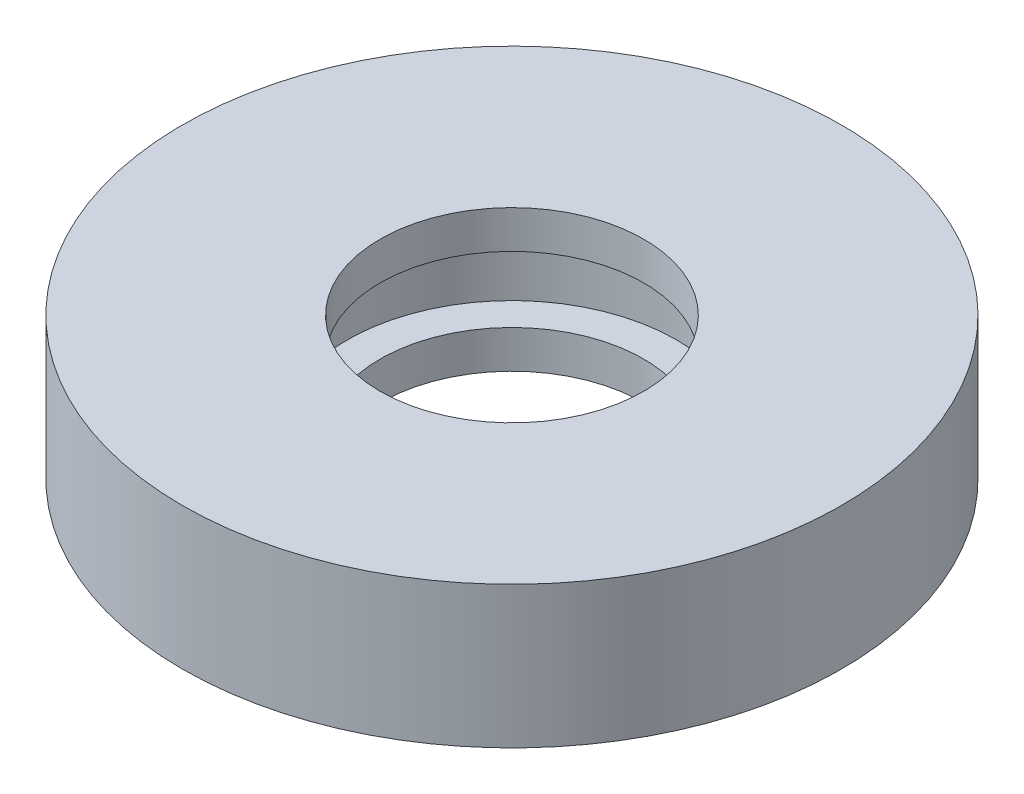
ISO-10303-21;
HEADER;
FILE_DESCRIPTION(('STEP AP214'),'2;1');
FILE_NAME('part.step','',(''),(''),'','','');
FILE_SCHEMA(('AUTOMOTIVE_DESIGN { 1 0 10303 214 1 1 1 1 }'));
ENDSEC;
DATA;
#1=APPLICATION_CONTEXT('core data for automotive mechanical design processes');
#2=APPLICATION_PROTOCOL_DEFINITION('international standard','automotive_design',2000,#1);
#3=PRODUCT_CONTEXT('',#1,'mechanical');
#4=PRODUCT('Part','Part','',(#3));
#5=PRODUCT_RELATED_PRODUCT_CATEGORY('part','',(#4));
#6=PRODUCT_DEFINITION_FORMATION('','',#4);
#7=PRODUCT_DEFINITION_CONTEXT('part definition',#1,'design');
#8=PRODUCT_DEFINITION('design','',#6,#7);
#9=PRODUCT_DEFINITION_SHAPE('','',#8);
#10=(LENGTH_UNIT() NAMED_UNIT(*) SI_UNIT(.MILLI.,.METRE.));
#11=(NAMED_UNIT(*) PLANE_ANGLE_UNIT() SI_UNIT($,.RADIAN.));
#12=(NAMED_UNIT(*) SI_UNIT($,.STERADIAN.) SOLID_ANGLE_UNIT());
#13=UNCERTAINTY_MEASURE_WITH_UNIT(LENGTH_MEASURE(1.E-05),#10,'distance_accuracy_value','');
#14=(GEOMETRIC_REPRESENTATION_CONTEXT(3) GLOBAL_UNCERTAINTY_ASSIGNED_CONTEXT((#13)) GLOBAL_UNIT_ASSIGNED_CONTEXT((#10,
#11,#12)) REPRESENTATION_CONTEXT('',''));
#15=CARTESIAN_POINT('',(0.,0.,0.));
#16=DIRECTION('',(0.,0.,1.));
#17=DIRECTION('',(1.,0.,0.));
#18=AXIS2_PLACEMENT_3D('',#15,#16,#17);
#19=CARTESIAN_POINT('',(0.,562.012987012987,0.));
#20=DIRECTION('',(0.,1.,0.));
#21=DIRECTION('',(0.,0.,1.));
#22=AXIS2_PLACEMENT_3D('',#19,#20,#21);
#23=CYLINDRICAL_SURFACE('',#22,499.999999999988);
#24=CARTESIAN_POINT('',(0.,-107.5,0.));
#25=DIRECTION('',(0.,1.,0.));
#26=DIRECTION('',(0.,0.,1.));
#27=AXIS2_PLACEMENT_3D('',#24,#25,#26);
#28=CIRCLE('',#27,499.999999999988);
#29=CARTESIAN_POINT('',(0.,-107.5,499.999999999988));
#30=VERTEX_POINT('',#29);
#31=EDGE_CURVE('E75',#30,#30,#28,.T.);
#32=ORIENTED_EDGE('',*,*,#31,.T.);
#33=EDGE_LOOP('',(#32));
#34=FACE_BOUND('',#33,.T.);
#35=CARTESIAN_POINT('',(0.,107.5,0.));
#36=DIRECTION('',(0.,1.,0.));
#37=DIRECTION('',(0.,0.,1.));
#38=AXIS2_PLACEMENT_3D('',#35,#36,#37);
#39=CIRCLE('',#38,499.999999999988);
#40=CARTESIAN_POINT('',(0.,107.5,499.999999999988));
#41=VERTEX_POINT('',#40);
#42=EDGE_CURVE('E10',#41,#41,#39,.T.);
#43=ORIENTED_EDGE('',*,*,#42,.F.);
#44=EDGE_LOOP('',(#43));
#45=FACE_BOUND('',#44,.T.);
#46=ADVANCED_FACE('F35',(#34,#45),#23,.T.);
#47=CARTESIAN_POINT('',(0.,107.5,199.999999999987));
#48=DIRECTION('',(0.,1.,0.));
#49=DIRECTION('',(0.,0.,1.));
#50=AXIS2_PLACEMENT_3D('',#47,#48,#49);
#51=PLANE('',#50);
#52=ORIENTED_EDGE('',*,*,#42,.T.);
#53=EDGE_LOOP('',(#52));
#54=FACE_BOUND('',#53,.T.);
#55=CARTESIAN_POINT('',(0.,107.5,0.));
#56=DIRECTION('',(0.,1.,0.));
#57=DIRECTION('',(0.,0.,1.));
#58=AXIS2_PLACEMENT_3D('',#55,#56,#57);
#59=CIRCLE('',#58,199.999999999987);
#60=CARTESIAN_POINT('',(0.,107.5,199.999999999987));
#61=VERTEX_POINT('',#60);
#62=EDGE_CURVE('E41',#61,#61,#59,.T.);
#63=ORIENTED_EDGE('',*,*,#62,.F.);
#64=EDGE_LOOP('',(#63));
#65=FACE_BOUND('',#64,.T.);
#66=ADVANCED_FACE('F95',(#54,#65),#51,.T.);
#67=CARTESIAN_POINT('',(0.,562.012987012987,0.));
#68=DIRECTION('',(0.,1.,0.));
#69=DIRECTION('',(0.,0.,1.));
#70=AXIS2_PLACEMENT_3D('',#67,#68,#69);
#71=CYLINDRICAL_SURFACE('',#70,199.999999999987);
#72=ORIENTED_EDGE('',*,*,#62,.T.);
#73=EDGE_LOOP('',(#72));
#74=FACE_BOUND('',#73,.T.);
#75=CARTESIAN_POINT('',(0.,49.9999999999999,0.));
#76=DIRECTION('',(0.,1.,0.));
#77=DIRECTION('',(0.,0.,1.));
#78=AXIS2_PLACEMENT_3D('',#75,#76,#77);
#79=CIRCLE('',#78,199.999999999987);
#80=CARTESIAN_POINT('',(0.,49.9999999999999,199.999999999987));
#81=VERTEX_POINT('',#80);
#82=EDGE_CURVE('E45',#81,#81,#79,.T.);
#83=ORIENTED_EDGE('',*,*,#82,.F.);
#84=EDGE_LOOP('',(#83));
#85=FACE_BOUND('',#84,.T.);
#86=ADVANCED_FACE('F99',(#74,#85),#71,.F.);
#87=CARTESIAN_POINT('',(0.,49.9999999999999,249.999999999987));
#88=DIRECTION('',(0.,-1.,0.));
#89=DIRECTION('',(0.,0.,-1.));
#90=AXIS2_PLACEMENT_3D('',#87,#88,#89);
#91=PLANE('',#90);
#92=ORIENTED_EDGE('',*,*,#82,.T.);
#93=EDGE_LOOP('',(#92));
#94=FACE_BOUND('',#93,.T.);
#95=CARTESIAN_POINT('',(0.,49.9999999999999,0.));
#96=DIRECTION('',(0.,1.,0.));
#97=DIRECTION('',(0.,0.,1.));
#98=AXIS2_PLACEMENT_3D('',#95,#96,#97);
#99=CIRCLE('',#98,249.999999999987);
#100=CARTESIAN_POINT('',(0.,49.9999999999999,249.999999999987));
#101=VERTEX_POINT('',#100);
#102=EDGE_CURVE('E49',#101,#101,#99,.T.);
#103=ORIENTED_EDGE('',*,*,#102,.F.);
#104=EDGE_LOOP('',(#103));
#105=FACE_BOUND('',#104,.T.);
#106=ADVANCED_FACE('F103',(#94,#105),#91,.T.);
#107=CARTESIAN_POINT('',(0.,562.012987012987,0.));
#108=DIRECTION('',(0.,1.,0.));
#109=DIRECTION('',(0.,0.,1.));
#110=AXIS2_PLACEMENT_3D('',#107,#108,#109);
#111=CYLINDRICAL_SURFACE('',#110,249.999999999987);
#112=ORIENTED_EDGE('',*,*,#102,.T.);
#113=EDGE_LOOP('',(#112));
#114=FACE_BOUND('',#113,.T.);
#115=CARTESIAN_POINT('',(0.,-49.9999999999999,0.));
#116=DIRECTION('',(0.,1.,0.));
#117=DIRECTION('',(0.,0.,1.));
#118=AXIS2_PLACEMENT_3D('',#115,#116,#117);
#119=CIRCLE('',#118,249.999999999987);
#120=CARTESIAN_POINT('',(0.,-49.9999999999999,249.999999999987));
#121=VERTEX_POINT('',#120);
#122=EDGE_CURVE('E54',#121,#121,#119,.T.);
#123=ORIENTED_EDGE('',*,*,#122,.F.);
#124=EDGE_LOOP('',(#123));
#125=FACE_BOUND('',#124,.T.);
#126=ADVANCED_FACE('F109',(#114,#125),#111,.F.);
#127=CARTESIAN_POINT('',(0.,-50.,249.999999999987));
#128=DIRECTION('',(0.,1.,0.));
#129=DIRECTION('',(0.,0.,1.));
#130=AXIS2_PLACEMENT_3D('',#127,#128,#129);
#131=PLANE('',#130);
#132=ORIENTED_EDGE('',*,*,#122,.T.);
#133=EDGE_LOOP('',(#132));
#134=FACE_BOUND('',#133,.T.);
#135=CARTESIAN_POINT('',(0.,-49.9999999999999,0.));
#136=DIRECTION('',(0.,1.,0.));
#137=DIRECTION('',(0.,0.,1.));
#138=AXIS2_PLACEMENT_3D('',#135,#136,#137);
#139=CIRCLE('',#138,199.999999999987);
#140=CARTESIAN_POINT('',(0.,-49.9999999999999,199.999999999987));
#141=VERTEX_POINT('',#140);
#142=EDGE_CURVE('E57',#141,#141,#139,.T.);
#143=ORIENTED_EDGE('',*,*,#142,.F.);
#144=EDGE_LOOP('',(#143));
#145=FACE_BOUND('',#144,.T.);
#146=ADVANCED_FACE('F113',(#134,#145),#131,.T.);
#147=CARTESIAN_POINT('',(0.,562.012987012987,0.));
#148=DIRECTION('',(0.,1.,0.));
#149=DIRECTION('',(0.,0.,1.));
#150=AXIS2_PLACEMENT_3D('',#147,#148,#149);
#151=CYLINDRICAL_SURFACE('',#150,199.999999999987);
#152=ORIENTED_EDGE('',*,*,#142,.T.);
#153=EDGE_LOOP('',(#152));
#154=FACE_BOUND('',#153,.T.);
#155=CARTESIAN_POINT('',(0.,-107.5,0.));
#156=DIRECTION('',(0.,1.,0.));
#157=DIRECTION('',(0.,0.,1.));
#158=AXIS2_PLACEMENT_3D('',#155,#156,#157);
#159=CIRCLE('',#158,199.999999999987);
#160=CARTESIAN_POINT('',(0.,-107.5,199.999999999987));
#161=VERTEX_POINT('',#160);
#162=EDGE_CURVE('E60',#161,#161,#159,.T.);
#163=ORIENTED_EDGE('',*,*,#162,.F.);
#164=EDGE_LOOP('',(#163));
#165=FACE_BOUND('',#164,.T.);
#166=ADVANCED_FACE('F117',(#154,#165),#151,.F.);
#167=CARTESIAN_POINT('',(0.,-107.5,219.999999999988));
#168=DIRECTION('',(0.,-1.,0.));
#169=DIRECTION('',(0.,0.,-1.));
#170=AXIS2_PLACEMENT_3D('',#167,#168,#169);
#171=PLANE('',#170);
#172=ORIENTED_EDGE('',*,*,#162,.T.);
#173=EDGE_LOOP('',(#172));
#174=FACE_BOUND('',#173,.T.);
#175=CARTESIAN_POINT('',(0.,-107.5,0.));
#176=DIRECTION('',(0.,1.,0.));
#177=DIRECTION('',(0.,0.,1.));
#178=AXIS2_PLACEMENT_3D('',#175,#176,#177);
#179=CIRCLE('',#178,219.999999999988);
#180=CARTESIAN_POINT('',(0.,-107.5,219.999999999988));
#181=VERTEX_POINT('',#180);
#182=EDGE_CURVE('E63',#181,#181,#179,.T.);
#183=ORIENTED_EDGE('',*,*,#182,.F.);
#184=EDGE_LOOP('',(#183));
#185=FACE_BOUND('',#184,.T.);
#186=ADVANCED_FACE('F121',(#174,#185),#171,.T.);
#187=CARTESIAN_POINT('',(0.,562.012987012987,0.));
#188=DIRECTION('',(0.,1.,0.));
#189=DIRECTION('',(0.,0.,1.));
#190=AXIS2_PLACEMENT_3D('',#187,#188,#189);
#191=CYLINDRICAL_SURFACE('',#190,219.999999999988);
#192=ORIENTED_EDGE('',*,*,#182,.T.);
#193=EDGE_LOOP('',(#192));
#194=FACE_BOUND('',#193,.T.);
#195=CARTESIAN_POINT('',(0.,-82.4999999999999,0.));
#196=DIRECTION('',(0.,1.,0.));
#197=DIRECTION('',(0.,0.,1.));
#198=AXIS2_PLACEMENT_3D('',#195,#196,#197);
#199=CIRCLE('',#198,219.999999999988);
#200=CARTESIAN_POINT('',(0.,-82.4999999999999,219.999999999988));
#201=VERTEX_POINT('',#200);
#202=EDGE_CURVE('E66',#201,#201,#199,.T.);
#203=ORIENTED_EDGE('',*,*,#202,.F.);
#204=EDGE_LOOP('',(#203));
#205=FACE_BOUND('',#204,.T.);
#206=ADVANCED_FACE('F125',(#194,#205),#191,.T.);
#207=CARTESIAN_POINT('',(0.,-82.5,275.));
#208=DIRECTION('',(0.,-1.,0.));
#209=DIRECTION('',(0.,0.,-1.));
#210=AXIS2_PLACEMENT_3D('',#207,#208,#209);
#211=PLANE('',#210);
#212=ORIENTED_EDGE('',*,*,#202,.T.);
#213=EDGE_LOOP('',(#212));
#214=FACE_BOUND('',#213,.T.);
#215=CARTESIAN_POINT('',(0.,-82.5,0.));
#216=DIRECTION('',(0.,1.,0.));
#217=DIRECTION('',(0.,0.,1.));
#218=AXIS2_PLACEMENT_3D('',#215,#216,#217);
#219=CIRCLE('',#218,275.);
#220=CARTESIAN_POINT('',(0.,-82.5,275.));
#221=VERTEX_POINT('',#220);
#222=EDGE_CURVE('E69',#221,#221,#219,.T.);
#223=ORIENTED_EDGE('',*,*,#222,.F.);
#224=EDGE_LOOP('',(#223));
#225=FACE_BOUND('',#224,.T.);
#226=ADVANCED_FACE('F90',(#214,#225),#211,.T.);
#227=CARTESIAN_POINT('',(0.,562.012987012987,0.));
#228=DIRECTION('',(0.,1.,0.));
#229=DIRECTION('',(0.,0.,1.));
#230=AXIS2_PLACEMENT_3D('',#227,#228,#229);
#231=CYLINDRICAL_SURFACE('',#230,275.);
#232=ORIENTED_EDGE('',*,*,#222,.T.);
#233=EDGE_LOOP('',(#232));
#234=FACE_BOUND('',#233,.T.);
#235=CARTESIAN_POINT('',(0.,-107.5,0.));
#236=DIRECTION('',(0.,1.,0.));
#237=DIRECTION('',(0.,0.,1.));
#238=AXIS2_PLACEMENT_3D('',#235,#236,#237);
#239=CIRCLE('',#238,275.);
#240=CARTESIAN_POINT('',(0.,-107.5,275.));
#241=VERTEX_POINT('',#240);
#242=EDGE_CURVE('E72',#241,#241,#239,.T.);
#243=ORIENTED_EDGE('',*,*,#242,.F.);
#244=EDGE_LOOP('',(#243));
#245=FACE_BOUND('',#244,.T.);
#246=ADVANCED_FACE('F83',(#234,#245),#231,.F.);
#247=CARTESIAN_POINT('',(0.,-107.5,275.));
#248=DIRECTION('',(0.,-1.,0.));
#249=DIRECTION('',(0.,0.,-1.));
#250=AXIS2_PLACEMENT_3D('',#247,#248,#249);
#251=PLANE('',#250);
#252=ORIENTED_EDGE('',*,*,#242,.T.);
#253=EDGE_LOOP('',(#252));
#254=FACE_BOUND('',#253,.T.);
#255=ORIENTED_EDGE('',*,*,#31,.F.);
#256=EDGE_LOOP('',(#255));
#257=FACE_BOUND('',#256,.T.);
#258=ADVANCED_FACE('F81',(#254,#257),#251,.T.);
#259=CLOSED_SHELL('',(#46,#66,#86,#106,#126,#146,#166,#186,#206,#226,#246,#258));
#260=CARTESIAN_POINT('',(-374.999999999987,0.,0.));
#261=DIRECTION('',(0.,1.,0.));
#262=DIRECTION('',(-1.,0.,0.));
#263=AXIS2_PLACEMENT_3D('',#260,#261,#262);
#264=SPHERICAL_SURFACE('',#263,100.);
#265=CARTESIAN_POINT('',(-374.999999999987,100.,0.));
#266=VERTEX_POINT('',#265);
#267=VERTEX_LOOP('',#266);
#268=FACE_BOUND('',#267,.T.);
#269=ADVANCED_FACE('F156',(#268),#264,.F.);
#270=CLOSED_SHELL('',(#269));
#271=CARTESIAN_POINT('',(-187.499999999993,0.,-324.759526419154));
#272=DIRECTION('',(0.,1.,0.));
#273=DIRECTION('',(-0.499999999999998,0.,-0.86602540378444));
#274=AXIS2_PLACEMENT_3D('',#271,#272,#273);
#275=SPHERICAL_SURFACE('',#274,100.);
#276=CARTESIAN_POINT('',(-187.499999999993,100.,-324.759526419154));
#277=VERTEX_POINT('',#276);
#278=VERTEX_LOOP('',#277);
#279=FACE_BOUND('',#278,.T.);
#280=ADVANCED_FACE('F165',(#279),#275,.F.);
#281=CLOSED_SHELL('',(#280));
#282=CARTESIAN_POINT('',(187.499999999995,0.,-324.759526419153));
#283=DIRECTION('',(0.,1.,0.));
#284=DIRECTION('',(0.500000000000004,0.,-0.866025403784436));
#285=AXIS2_PLACEMENT_3D('',#282,#283,#284);
#286=SPHERICAL_SURFACE('',#285,100.);
#287=CARTESIAN_POINT('',(187.499999999995,100.,-324.759526419153));
#288=VERTEX_POINT('',#287);
#289=VERTEX_LOOP('',#288);
#290=FACE_BOUND('',#289,.T.);
#291=ADVANCED_FACE('F176',(#290),#286,.F.);
#292=CLOSED_SHELL('',(#291));
#293=CARTESIAN_POINT('',(374.999999999987,0.,0.));
#294=DIRECTION('',(0.,1.,0.));
#295=DIRECTION('',(1.,0.,0.));
#296=AXIS2_PLACEMENT_3D('',#293,#294,#295);
#297=SPHERICAL_SURFACE('',#296,100.);
#298=CARTESIAN_POINT('',(374.999999999987,100.,0.));
#299=VERTEX_POINT('',#298);
#300=VERTEX_LOOP('',#299);
#301=FACE_BOUND('',#300,.T.);
#302=ADVANCED_FACE('F187',(#301),#297,.F.);
#303=CLOSED_SHELL('',(#302));
#304=CARTESIAN_POINT('',(187.499999999991,0.,324.759526419155));
#305=DIRECTION('',(0.,1.,0.));
#306=DIRECTION('',(0.499999999999992,0.,0.866025403784443));
#307=AXIS2_PLACEMENT_3D('',#304,#305,#306);
#308=SPHERICAL_SURFACE('',#307,100.);
#309=CARTESIAN_POINT('',(187.499999999991,100.,324.759526419155));
#310=VERTEX_POINT('',#309);
#311=VERTEX_LOOP('',#310);
#312=FACE_BOUND('',#311,.T.);
#313=ADVANCED_FACE('F198',(#312),#308,.F.);
#314=CLOSED_SHELL('',(#313));
#315=CARTESIAN_POINT('',(-187.499999999998,0.,324.759526419151));
#316=DIRECTION('',(0.,1.,0.));
#317=DIRECTION('',(-0.50000000000001,0.,0.866025403784433));
#318=AXIS2_PLACEMENT_3D('',#315,#316,#317);
#319=SPHERICAL_SURFACE('',#318,100.);
#320=CARTESIAN_POINT('',(-187.499999999998,100.,324.759526419151));
#321=VERTEX_POINT('',#320);
#322=VERTEX_LOOP('',#321);
#323=FACE_BOUND('',#322,.T.);
#324=ADVANCED_FACE('F209',(#323),#319,.F.);
#325=CLOSED_SHELL('',(#324));
#326=ORIENTED_CLOSED_SHELL('',*,#270,.T.);
#327=ORIENTED_CLOSED_SHELL('',*,#281,.T.);
#328=ORIENTED_CLOSED_SHELL('',*,#292,.T.);
#329=ORIENTED_CLOSED_SHELL('',*,#303,.T.);
#330=ORIENTED_CLOSED_SHELL('',*,#314,.T.);
#331=ORIENTED_CLOSED_SHELL('',*,#325,.T.);
#332=BREP_WITH_VOIDS('B2',#259,(#326,#327,#328,#329,#330,#331));
#333=ADVANCED_BREP_SHAPE_REPRESENTATION('',(#18,#332),#14);
#334=SHAPE_DEFINITION_REPRESENTATION(#9,#333);
ENDSEC;
END-ISO-10303-21;
